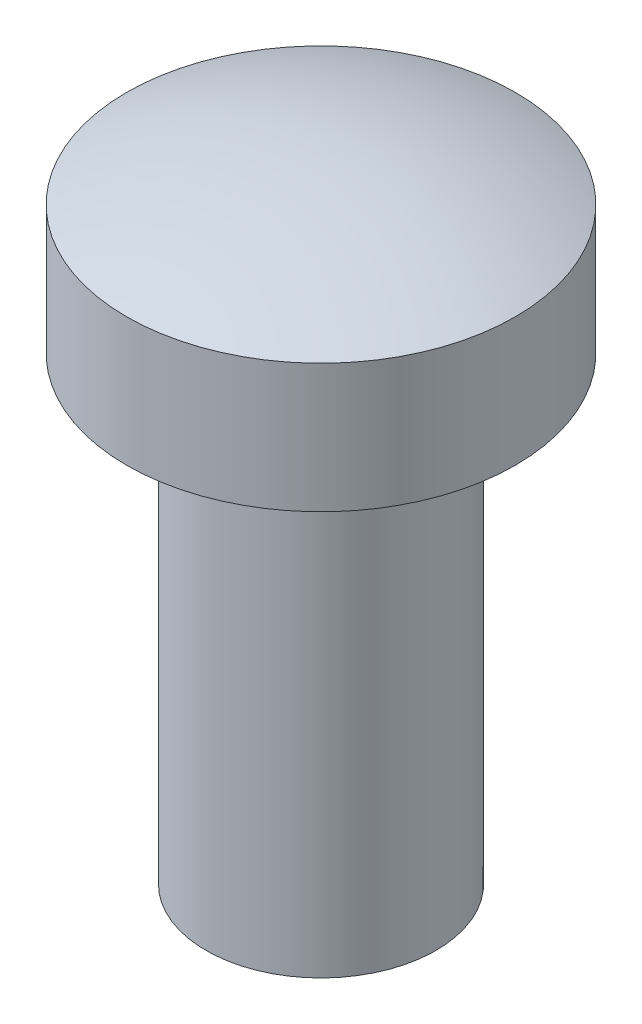
ISO-10303-21;
HEADER;
FILE_DESCRIPTION(('STEP AP214'),'2;1');
FILE_NAME('part.step','',(''),(''),'','','');
FILE_SCHEMA(('AUTOMOTIVE_DESIGN { 1 0 10303 214 1 1 1 1 }'));
ENDSEC;
DATA;
#1=APPLICATION_CONTEXT('core data for automotive mechanical design processes');
#2=APPLICATION_PROTOCOL_DEFINITION('international standard','automotive_design',2000,#1);
#3=PRODUCT_CONTEXT('',#1,'mechanical');
#4=PRODUCT('Part','Part','',(#3));
#5=PRODUCT_RELATED_PRODUCT_CATEGORY('part','',(#4));
#6=PRODUCT_DEFINITION_FORMATION('','',#4);
#7=PRODUCT_DEFINITION_CONTEXT('part definition',#1,'design');
#8=PRODUCT_DEFINITION('design','',#6,#7);
#9=PRODUCT_DEFINITION_SHAPE('','',#8);
#10=(LENGTH_UNIT() NAMED_UNIT(*) SI_UNIT(.MILLI.,.METRE.));
#11=(NAMED_UNIT(*) PLANE_ANGLE_UNIT() SI_UNIT($,.RADIAN.));
#12=(NAMED_UNIT(*) SI_UNIT($,.STERADIAN.) SOLID_ANGLE_UNIT());
#13=UNCERTAINTY_MEASURE_WITH_UNIT(LENGTH_MEASURE(1.E-05),#10,'distance_accuracy_value','');
#14=(GEOMETRIC_REPRESENTATION_CONTEXT(3) GLOBAL_UNCERTAINTY_ASSIGNED_CONTEXT((#13)) GLOBAL_UNIT_ASSIGNED_CONTEXT((#10,
#11,#12)) REPRESENTATION_CONTEXT('',''));
#15=CARTESIAN_POINT('',(0.,0.,0.));
#16=DIRECTION('',(0.,0.,1.));
#17=DIRECTION('',(1.,0.,0.));
#18=AXIS2_PLACEMENT_3D('',#15,#16,#17);
#19=CARTESIAN_POINT('',(-0.5,0.,0.));
#20=DIRECTION('',(0.,1.,0.));
#21=DIRECTION('',(0.,0.,1.));
#22=AXIS2_PLACEMENT_3D('',#19,#20,#21);
#23=PLANE('',#22);
#24=CARTESIAN_POINT('',(0.,0.,0.));
#25=DIRECTION('',(0.,-1.,0.));
#26=DIRECTION('',(0.,0.,-1.));
#27=AXIS2_PLACEMENT_3D('',#24,#25,#26);
#28=CIRCLE('',#27,0.5);
#29=CARTESIAN_POINT('',(0.,0.,-0.5));
#30=VERTEX_POINT('',#29);
#31=EDGE_CURVE('E49',#30,#30,#28,.T.);
#32=ORIENTED_EDGE('',*,*,#31,.T.);
#33=EDGE_LOOP('',(#32));
#34=FACE_BOUND('',#33,.T.);
#35=ADVANCED_FACE('F35',(#34),#23,.F.);
#36=CARTESIAN_POINT('',(0.,0.652059978474411,0.));
#37=DIRECTION('',(0.,-1.,0.));
#38=DIRECTION('',(-1.,0.,0.));
#39=AXIS2_PLACEMENT_3D('',#36,#37,#38);
#40=SPHERICAL_SURFACE('',#39,2.08617938322771);
#41=CARTESIAN_POINT('',(0.,2.55932024927531,0.));
#42=DIRECTION('',(0.,-1.,0.));
#43=DIRECTION('',(0.,0.,-1.));
#44=AXIS2_PLACEMENT_3D('',#41,#42,#43);
#45=CIRCLE('',#44,0.8452826027009);
#46=CARTESIAN_POINT('',(0.,2.55932024927531,-0.8452826027009));
#47=VERTEX_POINT('',#46);
#48=EDGE_CURVE('E10',#47,#47,#45,.T.);
#49=ORIENTED_EDGE('',*,*,#48,.F.);
#50=EDGE_LOOP('',(#49));
#51=FACE_BOUND('',#50,.T.);
#52=ADVANCED_FACE('F69',(#51),#40,.T.);
#53=CARTESIAN_POINT('',(0.,0.,0.));
#54=DIRECTION('',(0.,-1.,0.));
#55=DIRECTION('',(0.,0.,-1.));
#56=AXIS2_PLACEMENT_3D('',#53,#54,#55);
#57=CYLINDRICAL_SURFACE('',#56,0.8452826027009);
#58=CARTESIAN_POINT('',(0.,2.,0.));
#59=DIRECTION('',(0.,-1.,0.));
#60=DIRECTION('',(0.,0.,-1.));
#61=AXIS2_PLACEMENT_3D('',#58,#59,#60);
#62=CIRCLE('',#61,0.8452826027009);
#63=CARTESIAN_POINT('',(0.,2.,-0.8452826027009));
#64=VERTEX_POINT('',#63);
#65=EDGE_CURVE('E41',#64,#64,#62,.T.);
#66=ORIENTED_EDGE('',*,*,#65,.F.);
#67=EDGE_LOOP('',(#66));
#68=FACE_BOUND('',#67,.T.);
#69=ORIENTED_EDGE('',*,*,#48,.T.);
#70=EDGE_LOOP('',(#69));
#71=FACE_BOUND('',#70,.T.);
#72=ADVANCED_FACE('F64',(#68,#71),#57,.T.);
#73=CARTESIAN_POINT('',(-0.8452826027009,2.,0.));
#74=DIRECTION('',(0.,1.,0.));
#75=DIRECTION('',(0.,0.,1.));
#76=AXIS2_PLACEMENT_3D('',#73,#74,#75);
#77=PLANE('',#76);
#78=CARTESIAN_POINT('',(0.,2.,0.));
#79=DIRECTION('',(0.,-1.,0.));
#80=DIRECTION('',(0.,0.,-1.));
#81=AXIS2_PLACEMENT_3D('',#78,#79,#80);
#82=CIRCLE('',#81,0.5);
#83=CARTESIAN_POINT('',(0.,2.,-0.5));
#84=VERTEX_POINT('',#83);
#85=EDGE_CURVE('E45',#84,#84,#82,.T.);
#86=ORIENTED_EDGE('',*,*,#85,.F.);
#87=EDGE_LOOP('',(#86));
#88=FACE_BOUND('',#87,.T.);
#89=ORIENTED_EDGE('',*,*,#65,.T.);
#90=EDGE_LOOP('',(#89));
#91=FACE_BOUND('',#90,.T.);
#92=ADVANCED_FACE('F59',(#88,#91),#77,.F.);
#93=CARTESIAN_POINT('',(0.,0.,0.));
#94=DIRECTION('',(0.,-1.,0.));
#95=DIRECTION('',(0.,0.,-1.));
#96=AXIS2_PLACEMENT_3D('',#93,#94,#95);
#97=CYLINDRICAL_SURFACE('',#96,0.5);
#98=ORIENTED_EDGE('',*,*,#31,.F.);
#99=EDGE_LOOP('',(#98));
#100=FACE_BOUND('',#99,.T.);
#101=ORIENTED_EDGE('',*,*,#85,.T.);
#102=EDGE_LOOP('',(#101));
#103=FACE_BOUND('',#102,.T.);
#104=ADVANCED_FACE('F56',(#100,#103),#97,.T.);
#105=CLOSED_SHELL('',(#35,#52,#72,#92,#104));
#106=MANIFOLD_SOLID_BREP('B2',#105);
#107=ADVANCED_BREP_SHAPE_REPRESENTATION('',(#18,#106),#14);
#108=SHAPE_DEFINITION_REPRESENTATION(#9,#107);
ENDSEC;
END-ISO-10303-21;
